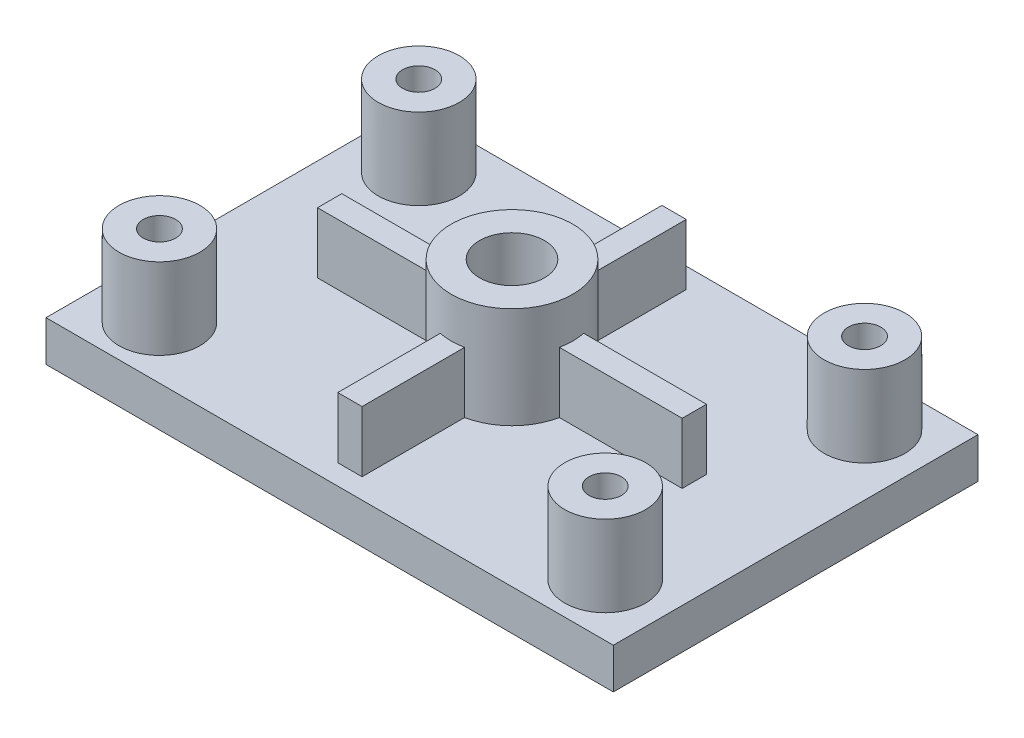
ISO-10303-21;
HEADER;
FILE_DESCRIPTION(('STEP AP214'),'2;1');
FILE_NAME('part.step','',(''),(''),'','','');
FILE_SCHEMA(('AUTOMOTIVE_DESIGN { 1 0 10303 214 1 1 1 1 }'));
ENDSEC;
DATA;
#1=APPLICATION_CONTEXT('core data for automotive mechanical design processes');
#2=APPLICATION_PROTOCOL_DEFINITION('international standard','automotive_design',2000,#1);
#3=PRODUCT_CONTEXT('',#1,'mechanical');
#4=PRODUCT('Part','Part','',(#3));
#5=PRODUCT_RELATED_PRODUCT_CATEGORY('part','',(#4));
#6=PRODUCT_DEFINITION_FORMATION('','',#4);
#7=PRODUCT_DEFINITION_CONTEXT('part definition',#1,'design');
#8=PRODUCT_DEFINITION('design','',#6,#7);
#9=PRODUCT_DEFINITION_SHAPE('','',#8);
#10=(LENGTH_UNIT() NAMED_UNIT(*) SI_UNIT(.MILLI.,.METRE.));
#11=(NAMED_UNIT(*) PLANE_ANGLE_UNIT() SI_UNIT($,.RADIAN.));
#12=(NAMED_UNIT(*) SI_UNIT($,.STERADIAN.) SOLID_ANGLE_UNIT());
#13=UNCERTAINTY_MEASURE_WITH_UNIT(LENGTH_MEASURE(1.E-05),#10,'distance_accuracy_value','');
#14=(GEOMETRIC_REPRESENTATION_CONTEXT(3) GLOBAL_UNCERTAINTY_ASSIGNED_CONTEXT((#13)) GLOBAL_UNIT_ASSIGNED_CONTEXT((#10,
#11,#12)) REPRESENTATION_CONTEXT('',''));
#15=CARTESIAN_POINT('',(0.,0.,0.));
#16=DIRECTION('',(0.,0.,1.));
#17=DIRECTION('',(1.,0.,0.));
#18=AXIS2_PLACEMENT_3D('',#15,#16,#17);
#19=CARTESIAN_POINT('',(45.,25.,3.));
#20=DIRECTION('',(0.,0.,-1.));
#21=DIRECTION('',(-1.,0.,0.));
#22=AXIS2_PLACEMENT_3D('',#19,#20,#21);
#23=PLANE('',#22);
#24=DIRECTION('',(0.,-1.,0.));
#25=VECTOR('',#24,1.);
#26=CARTESIAN_POINT('',(-14.6969384566991,35.,3.));
#27=LINE('',#26,#25);
#28=CARTESIAN_POINT('',(-14.6969384566991,25.,3.));
#29=VERTEX_POINT('',#28);
#30=CARTESIAN_POINT('',(-14.6969384566991,10.,3.));
#31=VERTEX_POINT('',#30);
#32=EDGE_CURVE('E285',#29,#31,#27,.T.);
#33=ORIENTED_EDGE('',*,*,#32,.F.);
#34=DIRECTION('',(1.,0.,0.));
#35=VECTOR('',#34,1.);
#36=CARTESIAN_POINT('',(45.,25.,3.));
#37=LINE('',#36,#35);
#38=CARTESIAN_POINT('',(-45.,25.,3.));
#39=VERTEX_POINT('',#38);
#40=EDGE_CURVE('E349',#39,#29,#37,.T.);
#41=ORIENTED_EDGE('',*,*,#40,.F.);
#42=DIRECTION('',(0.,-1.,0.));
#43=VECTOR('',#42,1.);
#44=CARTESIAN_POINT('',(-45.,25.,3.));
#45=LINE('',#44,#43);
#46=CARTESIAN_POINT('',(-45.,10.,3.));
#47=VERTEX_POINT('',#46);
#48=EDGE_CURVE('E386',#39,#47,#45,.T.);
#49=ORIENTED_EDGE('',*,*,#48,.T.);
#50=DIRECTION('',(1.,0.,0.));
#51=VECTOR('',#50,1.);
#52=CARTESIAN_POINT('',(45.,10.,3.));
#53=LINE('',#52,#51);
#54=EDGE_CURVE('E365',#47,#31,#53,.T.);
#55=ORIENTED_EDGE('',*,*,#54,.T.);
#56=EDGE_LOOP('',(#33,#41,#49,#55));
#57=FACE_BOUND('',#56,.T.);
#58=ADVANCED_FACE('F45',(#57),#23,.F.);
#59=DIRECTION('',(0.,-1.,0.));
#60=VECTOR('',#59,1.);
#61=CARTESIAN_POINT('',(14.6969384566991,35.,3.));
#62=LINE('',#61,#60);
#63=CARTESIAN_POINT('',(14.6969384566991,10.,3.));
#64=VERTEX_POINT('',#63);
#65=CARTESIAN_POINT('',(14.6969384566991,25.,3.));
#66=VERTEX_POINT('',#65);
#67=EDGE_CURVE('E71',#64,#66,#62,.F.);
#68=ORIENTED_EDGE('',*,*,#67,.F.);
#69=CARTESIAN_POINT('',(45.,10.,3.));
#70=VERTEX_POINT('',#69);
#71=EDGE_CURVE('E228',#64,#70,#53,.T.);
#72=ORIENTED_EDGE('',*,*,#71,.T.);
#73=DIRECTION('',(0.,-1.,0.));
#74=VECTOR('',#73,1.);
#75=CARTESIAN_POINT('',(45.,25.,3.));
#76=LINE('',#75,#74);
#77=CARTESIAN_POINT('',(45.,25.,3.));
#78=VERTEX_POINT('',#77);
#79=EDGE_CURVE('E382',#78,#70,#76,.T.);
#80=ORIENTED_EDGE('',*,*,#79,.F.);
#81=EDGE_CURVE('E347',#66,#78,#37,.T.);
#82=ORIENTED_EDGE('',*,*,#81,.F.);
#83=EDGE_LOOP('',(#68,#72,#80,#82));
#84=FACE_BOUND('',#83,.T.);
#85=ADVANCED_FACE('F594',(#84),#23,.F.);
#86=CARTESIAN_POINT('',(-45.,25.,-3.));
#87=DIRECTION('',(0.,0.,1.));
#88=DIRECTION('',(1.,0.,0.));
#89=AXIS2_PLACEMENT_3D('',#86,#87,#88);
#90=PLANE('',#89);
#91=DIRECTION('',(0.,-1.,0.));
#92=VECTOR('',#91,1.);
#93=CARTESIAN_POINT('',(-14.6969384566991,35.,-3.));
#94=LINE('',#93,#92);
#95=CARTESIAN_POINT('',(-14.6969384566991,10.,-3.));
#96=VERTEX_POINT('',#95);
#97=CARTESIAN_POINT('',(-14.6969384566991,25.,-3.));
#98=VERTEX_POINT('',#97);
#99=EDGE_CURVE('E255',#96,#98,#94,.F.);
#100=ORIENTED_EDGE('',*,*,#99,.F.);
#101=DIRECTION('',(-1.,0.,0.));
#102=VECTOR('',#101,1.);
#103=CARTESIAN_POINT('',(-45.,10.,-3.));
#104=LINE('',#103,#102);
#105=CARTESIAN_POINT('',(-45.,10.,-3.));
#106=VERTEX_POINT('',#105);
#107=EDGE_CURVE('E372',#96,#106,#104,.T.);
#108=ORIENTED_EDGE('',*,*,#107,.T.);
#109=DIRECTION('',(0.,-1.,0.));
#110=VECTOR('',#109,1.);
#111=CARTESIAN_POINT('',(-45.,25.,-3.));
#112=LINE('',#111,#110);
#113=CARTESIAN_POINT('',(-45.,25.,-3.));
#114=VERTEX_POINT('',#113);
#115=EDGE_CURVE('E361',#114,#106,#112,.T.);
#116=ORIENTED_EDGE('',*,*,#115,.F.);
#117=DIRECTION('',(-1.,0.,0.));
#118=VECTOR('',#117,1.);
#119=CARTESIAN_POINT('',(-45.,25.,-3.));
#120=LINE('',#119,#118);
#121=EDGE_CURVE('E356',#98,#114,#120,.T.);
#122=ORIENTED_EDGE('',*,*,#121,.F.);
#123=EDGE_LOOP('',(#100,#108,#116,#122));
#124=FACE_BOUND('',#123,.T.);
#125=ADVANCED_FACE('F599',(#124),#90,.F.);
#126=DIRECTION('',(0.,-1.,0.));
#127=VECTOR('',#126,1.);
#128=CARTESIAN_POINT('',(14.6969384566991,35.,-3.));
#129=LINE('',#128,#127);
#130=CARTESIAN_POINT('',(14.6969384566991,25.,-3.));
#131=VERTEX_POINT('',#130);
#132=CARTESIAN_POINT('',(14.6969384566991,10.,-3.));
#133=VERTEX_POINT('',#132);
#134=EDGE_CURVE('E270',#131,#133,#129,.T.);
#135=ORIENTED_EDGE('',*,*,#134,.F.);
#136=CARTESIAN_POINT('',(45.,25.,-3.));
#137=VERTEX_POINT('',#136);
#138=EDGE_CURVE('E357',#137,#131,#120,.T.);
#139=ORIENTED_EDGE('',*,*,#138,.F.);
#140=DIRECTION('',(0.,-1.,0.));
#141=VECTOR('',#140,1.);
#142=CARTESIAN_POINT('',(45.,25.,-3.));
#143=LINE('',#142,#141);
#144=CARTESIAN_POINT('',(45.,10.,-3.));
#145=VERTEX_POINT('',#144);
#146=EDGE_CURVE('E379',#137,#145,#143,.T.);
#147=ORIENTED_EDGE('',*,*,#146,.T.);
#148=EDGE_CURVE('E348',#145,#133,#104,.T.);
#149=ORIENTED_EDGE('',*,*,#148,.T.);
#150=EDGE_LOOP('',(#135,#139,#147,#149));
#151=FACE_BOUND('',#150,.T.);
#152=ADVANCED_FACE('F796',(#151),#90,.F.);
#153=CARTESIAN_POINT('',(0.,25.,0.));
#154=DIRECTION('',(0.,-1.,0.));
#155=DIRECTION('',(0.,0.,-1.));
#156=AXIS2_PLACEMENT_3D('',#153,#154,#155);
#157=PLANE('',#156);
#158=CARTESIAN_POINT('',(0.,25.,0.));
#159=DIRECTION('',(0.,-1.,0.));
#160=DIRECTION('',(0.,0.,-1.));
#161=AXIS2_PLACEMENT_3D('',#158,#159,#160);
#162=CIRCLE('',#161,15.);
#163=EDGE_CURVE('E244',#98,#29,#162,.F.);
#164=ORIENTED_EDGE('',*,*,#163,.F.);
#165=ORIENTED_EDGE('',*,*,#121,.T.);
#166=DIRECTION('',(0.,0.,1.));
#167=VECTOR('',#166,1.);
#168=CARTESIAN_POINT('',(-45.,25.,3.));
#169=LINE('',#168,#167);
#170=EDGE_CURVE('E343',#114,#39,#169,.T.);
#171=ORIENTED_EDGE('',*,*,#170,.T.);
#172=ORIENTED_EDGE('',*,*,#40,.T.);
#173=EDGE_LOOP('',(#164,#165,#171,#172));
#174=FACE_BOUND('',#173,.T.);
#175=ADVANCED_FACE('F629',(#174),#157,.F.);
#176=CARTESIAN_POINT('',(-3.,25.,14.6969384566991));
#177=VERTEX_POINT('',#176);
#178=CARTESIAN_POINT('',(3.,25.,14.6969384566991));
#179=VERTEX_POINT('',#178);
#180=EDGE_CURVE('E238',#177,#179,#162,.F.);
#181=ORIENTED_EDGE('',*,*,#180,.F.);
#182=DIRECTION('',(0.,0.,1.));
#183=VECTOR('',#182,1.);
#184=CARTESIAN_POINT('',(-3.,25.,40.));
#185=LINE('',#184,#183);
#186=CARTESIAN_POINT('',(-3.,25.,40.));
#187=VERTEX_POINT('',#186);
#188=EDGE_CURVE('E311',#177,#187,#185,.T.);
#189=ORIENTED_EDGE('',*,*,#188,.T.);
#190=DIRECTION('',(1.,0.,0.));
#191=VECTOR('',#190,1.);
#192=CARTESIAN_POINT('',(3.,25.,40.));
#193=LINE('',#192,#191);
#194=CARTESIAN_POINT('',(3.,25.,40.));
#195=VERTEX_POINT('',#194);
#196=EDGE_CURVE('E310',#187,#195,#193,.T.);
#197=ORIENTED_EDGE('',*,*,#196,.T.);
#198=DIRECTION('',(0.,0.,-1.));
#199=VECTOR('',#198,1.);
#200=CARTESIAN_POINT('',(3.,25.,-40.));
#201=LINE('',#200,#199);
#202=EDGE_CURVE('E314',#195,#179,#201,.T.);
#203=ORIENTED_EDGE('',*,*,#202,.T.);
#204=EDGE_LOOP('',(#181,#189,#197,#203));
#205=FACE_BOUND('',#204,.T.);
#206=ADVANCED_FACE('F815',(#205),#157,.F.);
#207=EDGE_CURVE('E256',#66,#131,#162,.F.);
#208=ORIENTED_EDGE('',*,*,#207,.F.);
#209=ORIENTED_EDGE('',*,*,#81,.T.);
#210=DIRECTION('',(0.,0.,-1.));
#211=VECTOR('',#210,1.);
#212=CARTESIAN_POINT('',(45.,25.,-3.));
#213=LINE('',#212,#211);
#214=EDGE_CURVE('E353',#78,#137,#213,.T.);
#215=ORIENTED_EDGE('',*,*,#214,.T.);
#216=ORIENTED_EDGE('',*,*,#138,.T.);
#217=EDGE_LOOP('',(#208,#209,#215,#216));
#218=FACE_BOUND('',#217,.T.);
#219=ADVANCED_FACE('F630',(#218),#157,.F.);
#220=CARTESIAN_POINT('',(3.,25.,-40.));
#221=DIRECTION('',(-1.,0.,0.));
#222=DIRECTION('',(0.,0.,1.));
#223=AXIS2_PLACEMENT_3D('',#220,#221,#222);
#224=PLANE('',#223);
#225=DIRECTION('',(0.,-1.,0.));
#226=VECTOR('',#225,1.);
#227=CARTESIAN_POINT('',(3.,35.,-14.6969384566991));
#228=LINE('',#227,#226);
#229=CARTESIAN_POINT('',(3.,10.,-14.6969384566991));
#230=VERTEX_POINT('',#229);
#231=CARTESIAN_POINT('',(3.,25.,-14.6969384566991));
#232=VERTEX_POINT('',#231);
#233=EDGE_CURVE('E259',#230,#232,#228,.F.);
#234=ORIENTED_EDGE('',*,*,#233,.F.);
#235=DIRECTION('',(0.,0.,-1.));
#236=VECTOR('',#235,1.);
#237=CARTESIAN_POINT('',(3.,10.,-40.));
#238=LINE('',#237,#236);
#239=CARTESIAN_POINT('',(3.,10.,-40.));
#240=VERTEX_POINT('',#239);
#241=EDGE_CURVE('E221',#230,#240,#238,.T.);
#242=ORIENTED_EDGE('',*,*,#241,.T.);
#243=DIRECTION('',(0.,-1.,0.));
#244=VECTOR('',#243,1.);
#245=CARTESIAN_POINT('',(3.,25.,-40.));
#246=LINE('',#245,#244);
#247=CARTESIAN_POINT('',(3.,25.,-40.));
#248=VERTEX_POINT('',#247);
#249=EDGE_CURVE('E333',#248,#240,#246,.T.);
#250=ORIENTED_EDGE('',*,*,#249,.F.);
#251=EDGE_CURVE('E313',#232,#248,#201,.T.);
#252=ORIENTED_EDGE('',*,*,#251,.F.);
#253=EDGE_LOOP('',(#234,#242,#250,#252));
#254=FACE_BOUND('',#253,.T.);
#255=ADVANCED_FACE('F835',(#254),#224,.F.);
#256=CARTESIAN_POINT('',(-3.,25.,40.));
#257=DIRECTION('',(1.,0.,0.));
#258=DIRECTION('',(0.,0.,-1.));
#259=AXIS2_PLACEMENT_3D('',#256,#257,#258);
#260=PLANE('',#259);
#261=DIRECTION('',(0.,-1.,0.));
#262=VECTOR('',#261,1.);
#263=CARTESIAN_POINT('',(-3.,35.,-14.6969384566991));
#264=LINE('',#263,#262);
#265=CARTESIAN_POINT('',(-3.,25.,-14.6969384566991));
#266=VERTEX_POINT('',#265);
#267=CARTESIAN_POINT('',(-3.,10.,-14.6969384566991));
#268=VERTEX_POINT('',#267);
#269=EDGE_CURVE('E249',#266,#268,#264,.T.);
#270=ORIENTED_EDGE('',*,*,#269,.F.);
#271=CARTESIAN_POINT('',(-3.,25.,-40.));
#272=VERTEX_POINT('',#271);
#273=EDGE_CURVE('E306',#272,#266,#185,.T.);
#274=ORIENTED_EDGE('',*,*,#273,.F.);
#275=DIRECTION('',(0.,-1.,0.));
#276=VECTOR('',#275,1.);
#277=CARTESIAN_POINT('',(-3.,25.,-40.));
#278=LINE('',#277,#276);
#279=CARTESIAN_POINT('',(-3.,10.,-40.));
#280=VERTEX_POINT('',#279);
#281=EDGE_CURVE('E320',#272,#280,#278,.T.);
#282=ORIENTED_EDGE('',*,*,#281,.T.);
#283=DIRECTION('',(0.,0.,1.));
#284=VECTOR('',#283,1.);
#285=CARTESIAN_POINT('',(-3.,10.,40.));
#286=LINE('',#285,#284);
#287=EDGE_CURVE('E321',#280,#268,#286,.T.);
#288=ORIENTED_EDGE('',*,*,#287,.T.);
#289=EDGE_LOOP('',(#270,#274,#282,#288));
#290=FACE_BOUND('',#289,.T.);
#291=ADVANCED_FACE('F846',(#290),#260,.F.);
#292=DIRECTION('',(0.,-1.,0.));
#293=VECTOR('',#292,1.);
#294=CARTESIAN_POINT('',(-3.,35.,14.6969384566991));
#295=LINE('',#294,#293);
#296=CARTESIAN_POINT('',(-3.,10.,14.6969384566991));
#297=VERTEX_POINT('',#296);
#298=EDGE_CURVE('E239',#297,#177,#295,.F.);
#299=ORIENTED_EDGE('',*,*,#298,.F.);
#300=CARTESIAN_POINT('',(-3.,10.,40.));
#301=VERTEX_POINT('',#300);
#302=EDGE_CURVE('E305',#297,#301,#286,.T.);
#303=ORIENTED_EDGE('',*,*,#302,.T.);
#304=DIRECTION('',(0.,-1.,0.));
#305=VECTOR('',#304,1.);
#306=CARTESIAN_POINT('',(-3.,25.,40.));
#307=LINE('',#306,#305);
#308=EDGE_CURVE('E338',#187,#301,#307,.T.);
#309=ORIENTED_EDGE('',*,*,#308,.F.);
#310=ORIENTED_EDGE('',*,*,#188,.F.);
#311=EDGE_LOOP('',(#299,#303,#309,#310));
#312=FACE_BOUND('',#311,.T.);
#313=ADVANCED_FACE('F857',(#312),#260,.F.);
#314=DIRECTION('',(0.,-1.,0.));
#315=VECTOR('',#314,1.);
#316=CARTESIAN_POINT('',(3.,35.,14.6969384566991));
#317=LINE('',#316,#315);
#318=CARTESIAN_POINT('',(3.,10.,14.6969384566991));
#319=VERTEX_POINT('',#318);
#320=EDGE_CURVE('E11',#179,#319,#317,.T.);
#321=ORIENTED_EDGE('',*,*,#320,.F.);
#322=ORIENTED_EDGE('',*,*,#202,.F.);
#323=DIRECTION('',(0.,-1.,0.));
#324=VECTOR('',#323,1.);
#325=CARTESIAN_POINT('',(3.,25.,40.));
#326=LINE('',#325,#324);
#327=CARTESIAN_POINT('',(3.,10.,40.));
#328=VERTEX_POINT('',#327);
#329=EDGE_CURVE('E217',#195,#328,#326,.T.);
#330=ORIENTED_EDGE('',*,*,#329,.T.);
#331=EDGE_CURVE('E211',#328,#319,#238,.T.);
#332=ORIENTED_EDGE('',*,*,#331,.T.);
#333=EDGE_LOOP('',(#321,#322,#330,#332));
#334=FACE_BOUND('',#333,.T.);
#335=ADVANCED_FACE('F213',(#334),#224,.F.);
#336=CARTESIAN_POINT('',(0.,10.,0.));
#337=DIRECTION('',(0.,-1.,0.));
#338=DIRECTION('',(0.,0.,-1.));
#339=AXIS2_PLACEMENT_3D('',#336,#337,#338);
#340=PLANE('',#339);
#341=CARTESIAN_POINT('',(0.,10.,0.));
#342=DIRECTION('',(0.,1.,0.));
#343=DIRECTION('',(0.,0.,1.));
#344=AXIS2_PLACEMENT_3D('',#341,#342,#343);
#345=CIRCLE('',#344,15.);
#346=EDGE_CURVE('E519',#268,#96,#345,.T.);
#347=ORIENTED_EDGE('',*,*,#346,.F.);
#348=ORIENTED_EDGE('',*,*,#287,.F.);
#349=DIRECTION('',(-1.,0.,0.));
#350=VECTOR('',#349,1.);
#351=CARTESIAN_POINT('',(-3.,10.,-40.));
#352=LINE('',#351,#350);
#353=EDGE_CURVE('E220',#240,#280,#352,.T.);
#354=ORIENTED_EDGE('',*,*,#353,.F.);
#355=ORIENTED_EDGE('',*,*,#241,.F.);
#356=EDGE_CURVE('E232',#133,#230,#345,.T.);
#357=ORIENTED_EDGE('',*,*,#356,.F.);
#358=ORIENTED_EDGE('',*,*,#148,.F.);
#359=DIRECTION('',(0.,0.,-1.));
#360=VECTOR('',#359,1.);
#361=CARTESIAN_POINT('',(45.,10.,-3.));
#362=LINE('',#361,#360);
#363=EDGE_CURVE('E368',#70,#145,#362,.T.);
#364=ORIENTED_EDGE('',*,*,#363,.F.);
#365=ORIENTED_EDGE('',*,*,#71,.F.);
#366=EDGE_CURVE('E224',#319,#64,#345,.T.);
#367=ORIENTED_EDGE('',*,*,#366,.F.);
#368=ORIENTED_EDGE('',*,*,#331,.F.);
#369=DIRECTION('',(1.,0.,0.));
#370=VECTOR('',#369,1.);
#371=CARTESIAN_POINT('',(3.,10.,40.));
#372=LINE('',#371,#370);
#373=EDGE_CURVE('E325',#301,#328,#372,.T.);
#374=ORIENTED_EDGE('',*,*,#373,.F.);
#375=ORIENTED_EDGE('',*,*,#302,.F.);
#376=EDGE_CURVE('E63',#31,#297,#345,.T.);
#377=ORIENTED_EDGE('',*,*,#376,.F.);
#378=ORIENTED_EDGE('',*,*,#54,.F.);
#379=DIRECTION('',(0.,0.,1.));
#380=VECTOR('',#379,1.);
#381=CARTESIAN_POINT('',(-45.,10.,3.));
#382=LINE('',#381,#380);
#383=EDGE_CURVE('E342',#106,#47,#382,.T.);
#384=ORIENTED_EDGE('',*,*,#383,.F.);
#385=ORIENTED_EDGE('',*,*,#107,.F.);
#386=EDGE_LOOP('',(#347,#348,#354,#355,#357,#358,#364,#365,#367,#368,#374,#375,#377,#378,#384,#385));
#387=FACE_BOUND('',#386,.T.);
#388=CARTESIAN_POINT('',(55.,10.,-32.));
#389=DIRECTION('',(0.,-1.,0.));
#390=DIRECTION('',(0.,0.,-1.));
#391=AXIS2_PLACEMENT_3D('',#388,#389,#390);
#392=CIRCLE('',#391,10.);
#393=CARTESIAN_POINT('',(55.,10.,-42.));
#394=VERTEX_POINT('',#393);
#395=EDGE_CURVE('E55',#394,#394,#392,.F.);
#396=ORIENTED_EDGE('',*,*,#395,.F.);
#397=EDGE_LOOP('',(#396));
#398=FACE_BOUND('',#397,.T.);
#399=CARTESIAN_POINT('',(-55.,10.,32.));
#400=DIRECTION('',(0.,-1.,0.));
#401=DIRECTION('',(0.,0.,-1.));
#402=AXIS2_PLACEMENT_3D('',#399,#400,#401);
#403=CIRCLE('',#402,10.);
#404=CARTESIAN_POINT('',(-55.,10.,22.));
#405=VERTEX_POINT('',#404);
#406=EDGE_CURVE('E481',#405,#405,#403,.F.);
#407=ORIENTED_EDGE('',*,*,#406,.F.);
#408=EDGE_LOOP('',(#407));
#409=FACE_BOUND('',#408,.T.);
#410=CARTESIAN_POINT('',(55.,10.,32.));
#411=DIRECTION('',(0.,-1.,0.));
#412=DIRECTION('',(0.,0.,-1.));
#413=AXIS2_PLACEMENT_3D('',#410,#411,#412);
#414=CIRCLE('',#413,10.);
#415=CARTESIAN_POINT('',(55.,10.,22.));
#416=VERTEX_POINT('',#415);
#417=EDGE_CURVE('E477',#416,#416,#414,.F.);
#418=ORIENTED_EDGE('',*,*,#417,.F.);
#419=EDGE_LOOP('',(#418));
#420=FACE_BOUND('',#419,.T.);
#421=CARTESIAN_POINT('',(-55.,10.,-32.));
#422=DIRECTION('',(0.,-1.,0.));
#423=DIRECTION('',(0.,0.,-1.));
#424=AXIS2_PLACEMENT_3D('',#421,#422,#423);
#425=CIRCLE('',#424,10.);
#426=CARTESIAN_POINT('',(-55.,10.,-42.));
#427=VERTEX_POINT('',#426);
#428=EDGE_CURVE('E473',#427,#427,#425,.F.);
#429=ORIENTED_EDGE('',*,*,#428,.F.);
#430=EDGE_LOOP('',(#429));
#431=FACE_BOUND('',#430,.T.);
#432=DIRECTION('',(0.,0.,1.));
#433=VECTOR('',#432,1.);
#434=CARTESIAN_POINT('',(-70.,10.,45.));
#435=LINE('',#434,#433);
#436=CARTESIAN_POINT('',(-70.,10.,-45.));
#437=VERTEX_POINT('',#436);
#438=CARTESIAN_POINT('',(-70.,10.,45.));
#439=VERTEX_POINT('',#438);
#440=EDGE_CURVE('E433',#437,#439,#435,.T.);
#441=ORIENTED_EDGE('',*,*,#440,.T.);
#442=DIRECTION('',(1.,0.,0.));
#443=VECTOR('',#442,1.);
#444=CARTESIAN_POINT('',(70.,10.,45.));
#445=LINE('',#444,#443);
#446=CARTESIAN_POINT('',(70.,10.,45.));
#447=VERTEX_POINT('',#446);
#448=EDGE_CURVE('E437',#439,#447,#445,.T.);
#449=ORIENTED_EDGE('',*,*,#448,.T.);
#450=DIRECTION('',(0.,0.,-1.));
#451=VECTOR('',#450,1.);
#452=CARTESIAN_POINT('',(70.,10.,-45.));
#453=LINE('',#452,#451);
#454=CARTESIAN_POINT('',(70.,10.,-45.));
#455=VERTEX_POINT('',#454);
#456=EDGE_CURVE('E441',#447,#455,#453,.T.);
#457=ORIENTED_EDGE('',*,*,#456,.T.);
#458=DIRECTION('',(-1.,0.,0.));
#459=VECTOR('',#458,1.);
#460=CARTESIAN_POINT('',(-70.,10.,-45.));
#461=LINE('',#460,#459);
#462=EDGE_CURVE('E444',#455,#437,#461,.T.);
#463=ORIENTED_EDGE('',*,*,#462,.T.);
#464=EDGE_LOOP('',(#441,#449,#457,#463));
#465=FACE_BOUND('',#464,.T.);
#466=ADVANCED_FACE('F225',(#387,#398,#409,#420,#431,#465),#340,.F.);
#467=CARTESIAN_POINT('',(0.,0.,0.));
#468=DIRECTION('',(0.,-1.,0.));
#469=DIRECTION('',(0.,0.,-1.));
#470=AXIS2_PLACEMENT_3D('',#467,#468,#469);
#471=PLANE('',#470);
#472=CARTESIAN_POINT('',(55.,0.,-32.));
#473=DIRECTION('',(0.,-1.,0.));
#474=DIRECTION('',(0.,0.,-1.));
#475=AXIS2_PLACEMENT_3D('',#472,#473,#474);
#476=CIRCLE('',#475,4.);
#477=CARTESIAN_POINT('',(55.,0.,-36.));
#478=VERTEX_POINT('',#477);
#479=EDGE_CURVE('E492',#478,#478,#476,.T.);
#480=ORIENTED_EDGE('',*,*,#479,.F.);
#481=EDGE_LOOP('',(#480));
#482=FACE_BOUND('',#481,.T.);
#483=CARTESIAN_POINT('',(-55.,0.,32.));
#484=DIRECTION('',(0.,-1.,0.));
#485=DIRECTION('',(0.,0.,-1.));
#486=AXIS2_PLACEMENT_3D('',#483,#484,#485);
#487=CIRCLE('',#486,4.);
#488=CARTESIAN_POINT('',(-55.,0.,28.));
#489=VERTEX_POINT('',#488);
#490=EDGE_CURVE('E497',#489,#489,#487,.T.);
#491=ORIENTED_EDGE('',*,*,#490,.F.);
#492=EDGE_LOOP('',(#491));
#493=FACE_BOUND('',#492,.T.);
#494=CARTESIAN_POINT('',(55.,0.,32.));
#495=DIRECTION('',(0.,-1.,0.));
#496=DIRECTION('',(0.,0.,-1.));
#497=AXIS2_PLACEMENT_3D('',#494,#495,#496);
#498=CIRCLE('',#497,4.);
#499=CARTESIAN_POINT('',(55.,0.,28.));
#500=VERTEX_POINT('',#499);
#501=EDGE_CURVE('E500',#500,#500,#498,.T.);
#502=ORIENTED_EDGE('',*,*,#501,.F.);
#503=EDGE_LOOP('',(#502));
#504=FACE_BOUND('',#503,.T.);
#505=CARTESIAN_POINT('',(-55.,0.,-32.));
#506=DIRECTION('',(0.,-1.,0.));
#507=DIRECTION('',(0.,0.,-1.));
#508=AXIS2_PLACEMENT_3D('',#505,#506,#507);
#509=CIRCLE('',#508,4.);
#510=CARTESIAN_POINT('',(-55.,0.,-36.));
#511=VERTEX_POINT('',#510);
#512=EDGE_CURVE('E513',#511,#511,#509,.T.);
#513=ORIENTED_EDGE('',*,*,#512,.F.);
#514=EDGE_LOOP('',(#513));
#515=FACE_BOUND('',#514,.T.);
#516=DIRECTION('',(0.,0.,1.));
#517=VECTOR('',#516,1.);
#518=CARTESIAN_POINT('',(-70.,0.,45.));
#519=LINE('',#518,#517);
#520=CARTESIAN_POINT('',(-70.,0.,-45.));
#521=VERTEX_POINT('',#520);
#522=CARTESIAN_POINT('',(-70.,0.,45.));
#523=VERTEX_POINT('',#522);
#524=EDGE_CURVE('E432',#521,#523,#519,.T.);
#525=ORIENTED_EDGE('',*,*,#524,.F.);
#526=DIRECTION('',(-1.,0.,0.));
#527=VECTOR('',#526,1.);
#528=CARTESIAN_POINT('',(-70.,0.,-45.));
#529=LINE('',#528,#527);
#530=CARTESIAN_POINT('',(70.,0.,-45.));
#531=VERTEX_POINT('',#530);
#532=EDGE_CURVE('E438',#531,#521,#529,.T.);
#533=ORIENTED_EDGE('',*,*,#532,.F.);
#534=DIRECTION('',(0.,0.,-1.));
#535=VECTOR('',#534,1.);
#536=CARTESIAN_POINT('',(70.,0.,-45.));
#537=LINE('',#536,#535);
#538=CARTESIAN_POINT('',(70.,0.,45.));
#539=VERTEX_POINT('',#538);
#540=EDGE_CURVE('E454',#539,#531,#537,.T.);
#541=ORIENTED_EDGE('',*,*,#540,.F.);
#542=DIRECTION('',(1.,0.,0.));
#543=VECTOR('',#542,1.);
#544=CARTESIAN_POINT('',(70.,0.,45.));
#545=LINE('',#544,#543);
#546=EDGE_CURVE('E451',#523,#539,#545,.T.);
#547=ORIENTED_EDGE('',*,*,#546,.F.);
#548=EDGE_LOOP('',(#525,#533,#541,#547));
#549=FACE_BOUND('',#548,.T.);
#550=DIRECTION('',(-1.,0.,0.));
#551=VECTOR('',#550,1.);
#552=CARTESIAN_POINT('',(-40.,0.,-25.));
#553=LINE('',#552,#551);
#554=CARTESIAN_POINT('',(40.,0.,-25.));
#555=VERTEX_POINT('',#554);
#556=CARTESIAN_POINT('',(-40.,0.,-25.));
#557=VERTEX_POINT('',#556);
#558=EDGE_CURVE('E396',#555,#557,#553,.T.);
#559=ORIENTED_EDGE('',*,*,#558,.T.);
#560=DIRECTION('',(0.,0.,1.));
#561=VECTOR('',#560,1.);
#562=CARTESIAN_POINT('',(-40.,0.,25.));
#563=LINE('',#562,#561);
#564=CARTESIAN_POINT('',(-40.,0.,25.));
#565=VERTEX_POINT('',#564);
#566=EDGE_CURVE('E390',#557,#565,#563,.T.);
#567=ORIENTED_EDGE('',*,*,#566,.T.);
#568=DIRECTION('',(1.,0.,0.));
#569=VECTOR('',#568,1.);
#570=CARTESIAN_POINT('',(40.,0.,25.));
#571=LINE('',#570,#569);
#572=CARTESIAN_POINT('',(40.,0.,25.));
#573=VERTEX_POINT('',#572);
#574=EDGE_CURVE('E409',#565,#573,#571,.T.);
#575=ORIENTED_EDGE('',*,*,#574,.T.);
#576=DIRECTION('',(0.,0.,-1.));
#577=VECTOR('',#576,1.);
#578=CARTESIAN_POINT('',(40.,0.,-25.));
#579=LINE('',#578,#577);
#580=EDGE_CURVE('E413',#573,#555,#579,.T.);
#581=ORIENTED_EDGE('',*,*,#580,.T.);
#582=EDGE_LOOP('',(#559,#567,#575,#581));
#583=FACE_BOUND('',#582,.T.);
#584=ADVANCED_FACE('F543',(#482,#493,#504,#515,#549,#583),#471,.T.);
#585=CARTESIAN_POINT('',(-70.,10.,45.));
#586=DIRECTION('',(1.,0.,0.));
#587=DIRECTION('',(0.,0.,-1.));
#588=AXIS2_PLACEMENT_3D('',#585,#586,#587);
#589=PLANE('',#588);
#590=ORIENTED_EDGE('',*,*,#524,.T.);
#591=DIRECTION('',(0.,-1.,0.));
#592=VECTOR('',#591,1.);
#593=CARTESIAN_POINT('',(-70.,10.,45.));
#594=LINE('',#593,#592);
#595=EDGE_CURVE('E469',#439,#523,#594,.T.);
#596=ORIENTED_EDGE('',*,*,#595,.F.);
#597=ORIENTED_EDGE('',*,*,#440,.F.);
#598=DIRECTION('',(0.,-1.,0.));
#599=VECTOR('',#598,1.);
#600=CARTESIAN_POINT('',(-70.,10.,-45.));
#601=LINE('',#600,#599);
#602=EDGE_CURVE('E447',#437,#521,#601,.T.);
#603=ORIENTED_EDGE('',*,*,#602,.T.);
#604=EDGE_LOOP('',(#590,#596,#597,#603));
#605=FACE_BOUND('',#604,.T.);
#606=ADVANCED_FACE('F47',(#605),#589,.F.);
#607=CARTESIAN_POINT('',(70.,10.,45.));
#608=DIRECTION('',(0.,0.,-1.));
#609=DIRECTION('',(-1.,0.,0.));
#610=AXIS2_PLACEMENT_3D('',#607,#608,#609);
#611=PLANE('',#610);
#612=ORIENTED_EDGE('',*,*,#546,.T.);
#613=DIRECTION('',(0.,-1.,0.));
#614=VECTOR('',#613,1.);
#615=CARTESIAN_POINT('',(70.,10.,45.));
#616=LINE('',#615,#614);
#617=EDGE_CURVE('E465',#447,#539,#616,.T.);
#618=ORIENTED_EDGE('',*,*,#617,.F.);
#619=ORIENTED_EDGE('',*,*,#448,.F.);
#620=ORIENTED_EDGE('',*,*,#595,.T.);
#621=EDGE_LOOP('',(#612,#618,#619,#620));
#622=FACE_BOUND('',#621,.T.);
#623=ADVANCED_FACE('F553',(#622),#611,.F.);
#624=CARTESIAN_POINT('',(70.,10.,-45.));
#625=DIRECTION('',(-1.,0.,0.));
#626=DIRECTION('',(0.,0.,1.));
#627=AXIS2_PLACEMENT_3D('',#624,#625,#626);
#628=PLANE('',#627);
#629=ORIENTED_EDGE('',*,*,#540,.T.);
#630=DIRECTION('',(0.,-1.,0.));
#631=VECTOR('',#630,1.);
#632=CARTESIAN_POINT('',(70.,10.,-45.));
#633=LINE('',#632,#631);
#634=EDGE_CURVE('E461',#455,#531,#633,.T.);
#635=ORIENTED_EDGE('',*,*,#634,.F.);
#636=ORIENTED_EDGE('',*,*,#456,.F.);
#637=ORIENTED_EDGE('',*,*,#617,.T.);
#638=EDGE_LOOP('',(#629,#635,#636,#637));
#639=FACE_BOUND('',#638,.T.);
#640=ADVANCED_FACE('F558',(#639),#628,.F.);
#641=CARTESIAN_POINT('',(-70.,10.,-45.));
#642=DIRECTION('',(0.,0.,1.));
#643=DIRECTION('',(1.,0.,0.));
#644=AXIS2_PLACEMENT_3D('',#641,#642,#643);
#645=PLANE('',#644);
#646=ORIENTED_EDGE('',*,*,#532,.T.);
#647=ORIENTED_EDGE('',*,*,#602,.F.);
#648=ORIENTED_EDGE('',*,*,#462,.F.);
#649=ORIENTED_EDGE('',*,*,#634,.T.);
#650=EDGE_LOOP('',(#646,#647,#648,#649));
#651=FACE_BOUND('',#650,.T.);
#652=ADVANCED_FACE('F561',(#651),#645,.F.);
#653=CARTESIAN_POINT('',(-40.,4.,25.));
#654=DIRECTION('',(1.,0.,0.));
#655=DIRECTION('',(0.,0.,-1.));
#656=AXIS2_PLACEMENT_3D('',#653,#654,#655);
#657=PLANE('',#656);
#658=ORIENTED_EDGE('',*,*,#566,.F.);
#659=DIRECTION('',(0.,-1.,0.));
#660=VECTOR('',#659,1.);
#661=CARTESIAN_POINT('',(-40.,4.,-25.));
#662=LINE('',#661,#660);
#663=CARTESIAN_POINT('',(-40.,4.,-25.));
#664=VERTEX_POINT('',#663);
#665=EDGE_CURVE('E405',#664,#557,#662,.T.);
#666=ORIENTED_EDGE('',*,*,#665,.F.);
#667=DIRECTION('',(0.,0.,1.));
#668=VECTOR('',#667,1.);
#669=CARTESIAN_POINT('',(-40.,4.,25.));
#670=LINE('',#669,#668);
#671=CARTESIAN_POINT('',(-40.,4.,25.));
#672=VERTEX_POINT('',#671);
#673=EDGE_CURVE('E391',#664,#672,#670,.T.);
#674=ORIENTED_EDGE('',*,*,#673,.T.);
#675=DIRECTION('',(0.,-1.,0.));
#676=VECTOR('',#675,1.);
#677=CARTESIAN_POINT('',(-40.,4.,25.));
#678=LINE('',#677,#676);
#679=EDGE_CURVE('E429',#672,#565,#678,.T.);
#680=ORIENTED_EDGE('',*,*,#679,.T.);
#681=EDGE_LOOP('',(#658,#666,#674,#680));
#682=FACE_BOUND('',#681,.T.);
#683=ADVANCED_FACE('F576',(#682),#657,.T.);
#684=CARTESIAN_POINT('',(40.,4.,25.));
#685=DIRECTION('',(0.,0.,-1.));
#686=DIRECTION('',(-1.,0.,0.));
#687=AXIS2_PLACEMENT_3D('',#684,#685,#686);
#688=PLANE('',#687);
#689=ORIENTED_EDGE('',*,*,#574,.F.);
#690=ORIENTED_EDGE('',*,*,#679,.F.);
#691=DIRECTION('',(1.,0.,0.));
#692=VECTOR('',#691,1.);
#693=CARTESIAN_POINT('',(40.,4.,25.));
#694=LINE('',#693,#692);
#695=CARTESIAN_POINT('',(40.,4.,25.));
#696=VERTEX_POINT('',#695);
#697=EDGE_CURVE('E395',#672,#696,#694,.T.);
#698=ORIENTED_EDGE('',*,*,#697,.T.);
#699=DIRECTION('',(0.,-1.,0.));
#700=VECTOR('',#699,1.);
#701=CARTESIAN_POINT('',(40.,4.,25.));
#702=LINE('',#701,#700);
#703=EDGE_CURVE('E426',#696,#573,#702,.T.);
#704=ORIENTED_EDGE('',*,*,#703,.T.);
#705=EDGE_LOOP('',(#689,#690,#698,#704));
#706=FACE_BOUND('',#705,.T.);
#707=ADVANCED_FACE('F583',(#706),#688,.T.);
#708=CARTESIAN_POINT('',(40.,4.,-25.));
#709=DIRECTION('',(-1.,0.,0.));
#710=DIRECTION('',(0.,0.,1.));
#711=AXIS2_PLACEMENT_3D('',#708,#709,#710);
#712=PLANE('',#711);
#713=ORIENTED_EDGE('',*,*,#580,.F.);
#714=ORIENTED_EDGE('',*,*,#703,.F.);
#715=DIRECTION('',(0.,0.,-1.));
#716=VECTOR('',#715,1.);
#717=CARTESIAN_POINT('',(40.,4.,-25.));
#718=LINE('',#717,#716);
#719=CARTESIAN_POINT('',(40.,4.,-25.));
#720=VERTEX_POINT('',#719);
#721=EDGE_CURVE('E399',#696,#720,#718,.T.);
#722=ORIENTED_EDGE('',*,*,#721,.T.);
#723=DIRECTION('',(0.,-1.,0.));
#724=VECTOR('',#723,1.);
#725=CARTESIAN_POINT('',(40.,4.,-25.));
#726=LINE('',#725,#724);
#727=EDGE_CURVE('E423',#720,#555,#726,.T.);
#728=ORIENTED_EDGE('',*,*,#727,.T.);
#729=EDGE_LOOP('',(#713,#714,#722,#728));
#730=FACE_BOUND('',#729,.T.);
#731=ADVANCED_FACE('F585',(#730),#712,.T.);
#732=CARTESIAN_POINT('',(-40.,4.,-25.));
#733=DIRECTION('',(0.,0.,1.));
#734=DIRECTION('',(1.,0.,0.));
#735=AXIS2_PLACEMENT_3D('',#732,#733,#734);
#736=PLANE('',#735);
#737=ORIENTED_EDGE('',*,*,#558,.F.);
#738=ORIENTED_EDGE('',*,*,#727,.F.);
#739=DIRECTION('',(-1.,0.,0.));
#740=VECTOR('',#739,1.);
#741=CARTESIAN_POINT('',(-40.,4.,-25.));
#742=LINE('',#741,#740);
#743=EDGE_CURVE('E402',#720,#664,#742,.T.);
#744=ORIENTED_EDGE('',*,*,#743,.T.);
#745=ORIENTED_EDGE('',*,*,#665,.T.);
#746=EDGE_LOOP('',(#737,#738,#744,#745));
#747=FACE_BOUND('',#746,.T.);
#748=ADVANCED_FACE('F571',(#747),#736,.T.);
#749=CARTESIAN_POINT('',(0.,4.,0.));
#750=DIRECTION('',(0.,-1.,0.));
#751=DIRECTION('',(0.,0.,-1.));
#752=AXIS2_PLACEMENT_3D('',#749,#750,#751);
#753=PLANE('',#752);
#754=ORIENTED_EDGE('',*,*,#673,.F.);
#755=ORIENTED_EDGE('',*,*,#743,.F.);
#756=ORIENTED_EDGE('',*,*,#721,.F.);
#757=ORIENTED_EDGE('',*,*,#697,.F.);
#758=EDGE_LOOP('',(#754,#755,#756,#757));
#759=FACE_BOUND('',#758,.T.);
#760=ADVANCED_FACE('F579',(#759),#753,.T.);
#761=CARTESIAN_POINT('',(-45.,25.,3.));
#762=DIRECTION('',(1.,0.,0.));
#763=DIRECTION('',(0.,0.,-1.));
#764=AXIS2_PLACEMENT_3D('',#761,#762,#763);
#765=PLANE('',#764);
#766=ORIENTED_EDGE('',*,*,#383,.T.);
#767=ORIENTED_EDGE('',*,*,#48,.F.);
#768=ORIENTED_EDGE('',*,*,#170,.F.);
#769=ORIENTED_EDGE('',*,*,#115,.T.);
#770=EDGE_LOOP('',(#766,#767,#768,#769));
#771=FACE_BOUND('',#770,.T.);
#772=ADVANCED_FACE('F604',(#771),#765,.F.);
#773=CARTESIAN_POINT('',(45.,25.,-3.));
#774=DIRECTION('',(-1.,0.,0.));
#775=DIRECTION('',(0.,0.,1.));
#776=AXIS2_PLACEMENT_3D('',#773,#774,#775);
#777=PLANE('',#776);
#778=ORIENTED_EDGE('',*,*,#363,.T.);
#779=ORIENTED_EDGE('',*,*,#146,.F.);
#780=ORIENTED_EDGE('',*,*,#214,.F.);
#781=ORIENTED_EDGE('',*,*,#79,.T.);
#782=EDGE_LOOP('',(#778,#779,#780,#781));
#783=FACE_BOUND('',#782,.T.);
#784=ADVANCED_FACE('F602',(#783),#777,.F.);
#785=EDGE_CURVE('E245',#232,#266,#162,.F.);
#786=ORIENTED_EDGE('',*,*,#785,.F.);
#787=ORIENTED_EDGE('',*,*,#251,.T.);
#788=DIRECTION('',(-1.,0.,0.));
#789=VECTOR('',#788,1.);
#790=CARTESIAN_POINT('',(-3.,25.,-40.));
#791=LINE('',#790,#789);
#792=EDGE_CURVE('E317',#248,#272,#791,.T.);
#793=ORIENTED_EDGE('',*,*,#792,.T.);
#794=ORIENTED_EDGE('',*,*,#273,.T.);
#795=EDGE_LOOP('',(#786,#787,#793,#794));
#796=FACE_BOUND('',#795,.T.);
#797=ADVANCED_FACE('F619',(#796),#157,.F.);
#798=CARTESIAN_POINT('',(-3.,25.,-40.));
#799=DIRECTION('',(0.,0.,1.));
#800=DIRECTION('',(1.,0.,0.));
#801=AXIS2_PLACEMENT_3D('',#798,#799,#800);
#802=PLANE('',#801);
#803=ORIENTED_EDGE('',*,*,#353,.T.);
#804=ORIENTED_EDGE('',*,*,#281,.F.);
#805=ORIENTED_EDGE('',*,*,#792,.F.);
#806=ORIENTED_EDGE('',*,*,#249,.T.);
#807=EDGE_LOOP('',(#803,#804,#805,#806));
#808=FACE_BOUND('',#807,.T.);
#809=ADVANCED_FACE('F626',(#808),#802,.F.);
#810=CARTESIAN_POINT('',(3.,25.,40.));
#811=DIRECTION('',(0.,0.,-1.));
#812=DIRECTION('',(-1.,0.,0.));
#813=AXIS2_PLACEMENT_3D('',#810,#811,#812);
#814=PLANE('',#813);
#815=ORIENTED_EDGE('',*,*,#373,.T.);
#816=ORIENTED_EDGE('',*,*,#329,.F.);
#817=ORIENTED_EDGE('',*,*,#196,.F.);
#818=ORIENTED_EDGE('',*,*,#308,.T.);
#819=EDGE_LOOP('',(#815,#816,#817,#818));
#820=FACE_BOUND('',#819,.T.);
#821=ADVANCED_FACE('F537',(#820),#814,.F.);
#822=CARTESIAN_POINT('',(-55.,30.,-32.));
#823=DIRECTION('',(0.,-1.,0.));
#824=DIRECTION('',(0.,0.,-1.));
#825=AXIS2_PLACEMENT_3D('',#822,#823,#824);
#826=CYLINDRICAL_SURFACE('',#825,10.);
#827=CARTESIAN_POINT('',(-55.,30.,-32.));
#828=DIRECTION('',(0.,1.,0.));
#829=DIRECTION('',(0.,0.,1.));
#830=AXIS2_PLACEMENT_3D('',#827,#828,#829);
#831=CIRCLE('',#830,10.);
#832=CARTESIAN_POINT('',(-55.,30.,-22.));
#833=VERTEX_POINT('',#832);
#834=EDGE_CURVE('E298',#833,#833,#831,.T.);
#835=ORIENTED_EDGE('',*,*,#834,.F.);
#836=EDGE_LOOP('',(#835));
#837=FACE_BOUND('',#836,.T.);
#838=ORIENTED_EDGE('',*,*,#428,.T.);
#839=EDGE_LOOP('',(#838));
#840=FACE_BOUND('',#839,.T.);
#841=ADVANCED_FACE('F531',(#837,#840),#826,.T.);
#842=CARTESIAN_POINT('',(-55.,30.,-32.));
#843=DIRECTION('',(0.,1.,0.));
#844=DIRECTION('',(0.,0.,1.));
#845=AXIS2_PLACEMENT_3D('',#842,#843,#844);
#846=PLANE('',#845);
#847=CARTESIAN_POINT('',(-55.,30.,-32.));
#848=DIRECTION('',(0.,1.,0.));
#849=DIRECTION('',(0.,0.,1.));
#850=AXIS2_PLACEMENT_3D('',#847,#848,#849);
#851=CIRCLE('',#850,4.);
#852=CARTESIAN_POINT('',(-55.,30.,-28.));
#853=VERTEX_POINT('',#852);
#854=EDGE_CURVE('E49',#853,#853,#851,.T.);
#855=ORIENTED_EDGE('',*,*,#854,.F.);
#856=EDGE_LOOP('',(#855));
#857=FACE_BOUND('',#856,.T.);
#858=ORIENTED_EDGE('',*,*,#834,.T.);
#859=EDGE_LOOP('',(#858));
#860=FACE_BOUND('',#859,.T.);
#861=ADVANCED_FACE('F527',(#857,#860),#846,.T.);
#862=CARTESIAN_POINT('',(55.,30.,32.));
#863=DIRECTION('',(0.,-1.,0.));
#864=DIRECTION('',(0.,0.,-1.));
#865=AXIS2_PLACEMENT_3D('',#862,#863,#864);
#866=CYLINDRICAL_SURFACE('',#865,10.);
#867=CARTESIAN_POINT('',(55.,30.,32.));
#868=DIRECTION('',(0.,1.,0.));
#869=DIRECTION('',(0.,0.,1.));
#870=AXIS2_PLACEMENT_3D('',#867,#868,#869);
#871=CIRCLE('',#870,10.);
#872=CARTESIAN_POINT('',(55.,30.,42.));
#873=VERTEX_POINT('',#872);
#874=EDGE_CURVE('E289',#873,#873,#871,.T.);
#875=ORIENTED_EDGE('',*,*,#874,.F.);
#876=EDGE_LOOP('',(#875));
#877=FACE_BOUND('',#876,.T.);
#878=ORIENTED_EDGE('',*,*,#417,.T.);
#879=EDGE_LOOP('',(#878));
#880=FACE_BOUND('',#879,.T.);
#881=ADVANCED_FACE('F530',(#877,#880),#866,.T.);
#882=CARTESIAN_POINT('',(55.,30.,32.));
#883=DIRECTION('',(0.,1.,0.));
#884=DIRECTION('',(0.,0.,1.));
#885=AXIS2_PLACEMENT_3D('',#882,#883,#884);
#886=PLANE('',#885);
#887=CARTESIAN_POINT('',(55.,30.,32.));
#888=DIRECTION('',(0.,1.,0.));
#889=DIRECTION('',(0.,0.,1.));
#890=AXIS2_PLACEMENT_3D('',#887,#888,#889);
#891=CIRCLE('',#890,4.);
#892=CARTESIAN_POINT('',(55.,30.,36.));
#893=VERTEX_POINT('',#892);
#894=EDGE_CURVE('E498',#893,#893,#891,.T.);
#895=ORIENTED_EDGE('',*,*,#894,.F.);
#896=EDGE_LOOP('',(#895));
#897=FACE_BOUND('',#896,.T.);
#898=ORIENTED_EDGE('',*,*,#874,.T.);
#899=EDGE_LOOP('',(#898));
#900=FACE_BOUND('',#899,.T.);
#901=ADVANCED_FACE('F656',(#897,#900),#886,.T.);
#902=CARTESIAN_POINT('',(-55.,30.,32.));
#903=DIRECTION('',(0.,-1.,0.));
#904=DIRECTION('',(0.,0.,-1.));
#905=AXIS2_PLACEMENT_3D('',#902,#903,#904);
#906=CYLINDRICAL_SURFACE('',#905,10.);
#907=CARTESIAN_POINT('',(-55.,30.,32.));
#908=DIRECTION('',(0.,1.,0.));
#909=DIRECTION('',(0.,0.,1.));
#910=AXIS2_PLACEMENT_3D('',#907,#908,#909);
#911=CIRCLE('',#910,10.);
#912=CARTESIAN_POINT('',(-55.,30.,42.));
#913=VERTEX_POINT('',#912);
#914=EDGE_CURVE('E293',#913,#913,#911,.T.);
#915=ORIENTED_EDGE('',*,*,#914,.F.);
#916=EDGE_LOOP('',(#915));
#917=FACE_BOUND('',#916,.T.);
#918=ORIENTED_EDGE('',*,*,#406,.T.);
#919=EDGE_LOOP('',(#918));
#920=FACE_BOUND('',#919,.T.);
#921=ADVANCED_FACE('F663',(#917,#920),#906,.T.);
#922=CARTESIAN_POINT('',(-55.,30.,32.));
#923=DIRECTION('',(0.,1.,0.));
#924=DIRECTION('',(0.,0.,1.));
#925=AXIS2_PLACEMENT_3D('',#922,#923,#924);
#926=PLANE('',#925);
#927=CARTESIAN_POINT('',(-55.,30.,32.));
#928=DIRECTION('',(0.,1.,0.));
#929=DIRECTION('',(0.,0.,1.));
#930=AXIS2_PLACEMENT_3D('',#927,#928,#929);
#931=CIRCLE('',#930,4.);
#932=CARTESIAN_POINT('',(-55.,30.,36.));
#933=VERTEX_POINT('',#932);
#934=EDGE_CURVE('E494',#933,#933,#931,.T.);
#935=ORIENTED_EDGE('',*,*,#934,.F.);
#936=EDGE_LOOP('',(#935));
#937=FACE_BOUND('',#936,.T.);
#938=ORIENTED_EDGE('',*,*,#914,.T.);
#939=EDGE_LOOP('',(#938));
#940=FACE_BOUND('',#939,.T.);
#941=ADVANCED_FACE('F670',(#937,#940),#926,.T.);
#942=CARTESIAN_POINT('',(55.,30.,-32.));
#943=DIRECTION('',(0.,-1.,0.));
#944=DIRECTION('',(0.,0.,-1.));
#945=AXIS2_PLACEMENT_3D('',#942,#943,#944);
#946=CYLINDRICAL_SURFACE('',#945,10.);
#947=CARTESIAN_POINT('',(55.,30.,-32.));
#948=DIRECTION('',(0.,1.,0.));
#949=DIRECTION('',(0.,0.,1.));
#950=AXIS2_PLACEMENT_3D('',#947,#948,#949);
#951=CIRCLE('',#950,10.);
#952=CARTESIAN_POINT('',(55.,30.,-22.));
#953=VERTEX_POINT('',#952);
#954=EDGE_CURVE('E294',#953,#953,#951,.T.);
#955=ORIENTED_EDGE('',*,*,#954,.F.);
#956=EDGE_LOOP('',(#955));
#957=FACE_BOUND('',#956,.T.);
#958=ORIENTED_EDGE('',*,*,#395,.T.);
#959=EDGE_LOOP('',(#958));
#960=FACE_BOUND('',#959,.T.);
#961=ADVANCED_FACE('F677',(#957,#960),#946,.T.);
#962=CARTESIAN_POINT('',(55.,30.,-32.));
#963=DIRECTION('',(0.,1.,0.));
#964=DIRECTION('',(0.,0.,1.));
#965=AXIS2_PLACEMENT_3D('',#962,#963,#964);
#966=PLANE('',#965);
#967=CARTESIAN_POINT('',(55.,30.,-32.));
#968=DIRECTION('',(0.,1.,0.));
#969=DIRECTION('',(0.,0.,1.));
#970=AXIS2_PLACEMENT_3D('',#967,#968,#969);
#971=CIRCLE('',#970,4.);
#972=CARTESIAN_POINT('',(55.,30.,-28.));
#973=VERTEX_POINT('',#972);
#974=EDGE_CURVE('E488',#973,#973,#971,.T.);
#975=ORIENTED_EDGE('',*,*,#974,.F.);
#976=EDGE_LOOP('',(#975));
#977=FACE_BOUND('',#976,.T.);
#978=ORIENTED_EDGE('',*,*,#954,.T.);
#979=EDGE_LOOP('',(#978));
#980=FACE_BOUND('',#979,.T.);
#981=ADVANCED_FACE('F684',(#977,#980),#966,.T.);
#982=CARTESIAN_POINT('',(0.,35.,0.));
#983=DIRECTION('',(0.,-1.,0.));
#984=DIRECTION('',(0.,0.,-1.));
#985=AXIS2_PLACEMENT_3D('',#982,#983,#984);
#986=CYLINDRICAL_SURFACE('',#985,15.);
#987=CARTESIAN_POINT('',(0.,35.,0.));
#988=DIRECTION('',(0.,1.,0.));
#989=DIRECTION('',(0.,0.,1.));
#990=AXIS2_PLACEMENT_3D('',#987,#988,#989);
#991=CIRCLE('',#990,15.);
#992=CARTESIAN_POINT('',(0.,35.,15.));
#993=VERTEX_POINT('',#992);
#994=EDGE_CURVE('E231',#993,#993,#991,.T.);
#995=ORIENTED_EDGE('',*,*,#994,.F.);
#996=EDGE_LOOP('',(#995));
#997=FACE_BOUND('',#996,.T.);
#998=ORIENTED_EDGE('',*,*,#163,.T.);
#999=ORIENTED_EDGE('',*,*,#32,.T.);
#1000=ORIENTED_EDGE('',*,*,#376,.T.);
#1001=ORIENTED_EDGE('',*,*,#298,.T.);
#1002=ORIENTED_EDGE('',*,*,#180,.T.);
#1003=ORIENTED_EDGE('',*,*,#320,.T.);
#1004=ORIENTED_EDGE('',*,*,#366,.T.);
#1005=ORIENTED_EDGE('',*,*,#67,.T.);
#1006=ORIENTED_EDGE('',*,*,#207,.T.);
#1007=ORIENTED_EDGE('',*,*,#134,.T.);
#1008=ORIENTED_EDGE('',*,*,#356,.T.);
#1009=ORIENTED_EDGE('',*,*,#233,.T.);
#1010=ORIENTED_EDGE('',*,*,#785,.T.);
#1011=ORIENTED_EDGE('',*,*,#269,.T.);
#1012=ORIENTED_EDGE('',*,*,#346,.T.);
#1013=ORIENTED_EDGE('',*,*,#99,.T.);
#1014=EDGE_LOOP('',(#998,#999,#1000,#1001,#1002,#1003,#1004,#1005,#1006,#1007,#1008,#1009,#1010,
#1011,#1012,#1013));
#1015=FACE_BOUND('',#1014,.T.);
#1016=ADVANCED_FACE('F236',(#997,#1015),#986,.T.);
#1017=CARTESIAN_POINT('',(0.,35.,0.));
#1018=DIRECTION('',(0.,1.,0.));
#1019=DIRECTION('',(0.,0.,1.));
#1020=AXIS2_PLACEMENT_3D('',#1017,#1018,#1019);
#1021=PLANE('',#1020);
#1022=CARTESIAN_POINT('',(0.,35.,0.));
#1023=DIRECTION('',(0.,1.,0.));
#1024=DIRECTION('',(0.,0.,1.));
#1025=AXIS2_PLACEMENT_3D('',#1022,#1023,#1024);
#1026=CIRCLE('',#1025,8.);
#1027=CARTESIAN_POINT('',(0.,35.,8.));
#1028=VERTEX_POINT('',#1027);
#1029=EDGE_CURVE('E1068',#1028,#1028,#1026,.T.);
#1030=ORIENTED_EDGE('',*,*,#1029,.F.);
#1031=EDGE_LOOP('',(#1030));
#1032=FACE_BOUND('',#1031,.T.);
#1033=ORIENTED_EDGE('',*,*,#994,.T.);
#1034=EDGE_LOOP('',(#1033));
#1035=FACE_BOUND('',#1034,.T.);
#1036=ADVANCED_FACE('F696',(#1032,#1035),#1021,.T.);
#1037=CARTESIAN_POINT('',(55.,-111.,-32.));
#1038=DIRECTION('',(0.,1.,0.));
#1039=DIRECTION('',(0.,0.,1.));
#1040=AXIS2_PLACEMENT_3D('',#1037,#1038,#1039);
#1041=CYLINDRICAL_SURFACE('',#1040,4.);
#1042=ORIENTED_EDGE('',*,*,#479,.T.);
#1043=EDGE_LOOP('',(#1042));
#1044=FACE_BOUND('',#1043,.T.);
#1045=ORIENTED_EDGE('',*,*,#974,.T.);
#1046=EDGE_LOOP('',(#1045));
#1047=FACE_BOUND('',#1046,.T.);
#1048=ADVANCED_FACE('F703',(#1044,#1047),#1041,.F.);
#1049=CARTESIAN_POINT('',(-55.,-111.,32.));
#1050=DIRECTION('',(0.,1.,0.));
#1051=DIRECTION('',(0.,0.,1.));
#1052=AXIS2_PLACEMENT_3D('',#1049,#1050,#1051);
#1053=CYLINDRICAL_SURFACE('',#1052,4.);
#1054=ORIENTED_EDGE('',*,*,#490,.T.);
#1055=EDGE_LOOP('',(#1054));
#1056=FACE_BOUND('',#1055,.T.);
#1057=ORIENTED_EDGE('',*,*,#934,.T.);
#1058=EDGE_LOOP('',(#1057));
#1059=FACE_BOUND('',#1058,.T.);
#1060=ADVANCED_FACE('F711',(#1056,#1059),#1053,.F.);
#1061=CARTESIAN_POINT('',(55.,-111.,32.));
#1062=DIRECTION('',(0.,1.,0.));
#1063=DIRECTION('',(0.,0.,1.));
#1064=AXIS2_PLACEMENT_3D('',#1061,#1062,#1063);
#1065=CYLINDRICAL_SURFACE('',#1064,4.);
#1066=ORIENTED_EDGE('',*,*,#501,.T.);
#1067=EDGE_LOOP('',(#1066));
#1068=FACE_BOUND('',#1067,.T.);
#1069=ORIENTED_EDGE('',*,*,#894,.T.);
#1070=EDGE_LOOP('',(#1069));
#1071=FACE_BOUND('',#1070,.T.);
#1072=ADVANCED_FACE('F718',(#1068,#1071),#1065,.F.);
#1073=CARTESIAN_POINT('',(-55.,-111.,-32.));
#1074=DIRECTION('',(0.,1.,0.));
#1075=DIRECTION('',(0.,0.,1.));
#1076=AXIS2_PLACEMENT_3D('',#1073,#1074,#1075);
#1077=CYLINDRICAL_SURFACE('',#1076,4.);
#1078=ORIENTED_EDGE('',*,*,#512,.T.);
#1079=EDGE_LOOP('',(#1078));
#1080=FACE_BOUND('',#1079,.T.);
#1081=ORIENTED_EDGE('',*,*,#854,.T.);
#1082=EDGE_LOOP('',(#1081));
#1083=FACE_BOUND('',#1082,.T.);
#1084=ADVANCED_FACE('F525',(#1080,#1083),#1077,.F.);
#1085=CARTESIAN_POINT('',(0.,15.,0.));
#1086=DIRECTION('',(0.,1.,0.));
#1087=DIRECTION('',(0.,0.,1.));
#1088=AXIS2_PLACEMENT_3D('',#1085,#1086,#1087);
#1089=CYLINDRICAL_SURFACE('',#1088,8.);
#1090=CARTESIAN_POINT('',(0.,15.,0.));
#1091=DIRECTION('',(0.,1.,0.));
#1092=DIRECTION('',(0.,0.,1.));
#1093=AXIS2_PLACEMENT_3D('',#1090,#1091,#1092);
#1094=CIRCLE('',#1093,8.);
#1095=CARTESIAN_POINT('',(0.,15.,8.));
#1096=VERTEX_POINT('',#1095);
#1097=EDGE_CURVE('E493',#1096,#1096,#1094,.T.);
#1098=ORIENTED_EDGE('',*,*,#1097,.F.);
#1099=EDGE_LOOP('',(#1098));
#1100=FACE_BOUND('',#1099,.T.);
#1101=ORIENTED_EDGE('',*,*,#1029,.T.);
#1102=EDGE_LOOP('',(#1101));
#1103=FACE_BOUND('',#1102,.T.);
#1104=ADVANCED_FACE('F729',(#1100,#1103),#1089,.F.);
#1105=CARTESIAN_POINT('',(0.,15.,0.));
#1106=DIRECTION('',(0.,1.,0.));
#1107=DIRECTION('',(0.,0.,1.));
#1108=AXIS2_PLACEMENT_3D('',#1105,#1106,#1107);
#1109=PLANE('',#1108);
#1110=ORIENTED_EDGE('',*,*,#1097,.T.);
#1111=EDGE_LOOP('',(#1110));
#1112=FACE_BOUND('',#1111,.T.);
#1113=ADVANCED_FACE('F734',(#1112),#1109,.T.);
#1114=CLOSED_SHELL('',(#58,#85,#125,#152,#175,#206,#219,#255,#291,#313,#335,#466,#584,#606,#623,
#640,#652,#683,#707,#731,#748,#760,#772,#784,#797,#809,#821,#841,#861,#881,#901,#921,#941,#961,
#981,#1016,#1036,#1048,#1060,#1072,#1084,#1104,#1113));
#1115=MANIFOLD_SOLID_BREP('B2',#1114);
#1116=ADVANCED_BREP_SHAPE_REPRESENTATION('',(#18,#1115),#14);
#1117=SHAPE_DEFINITION_REPRESENTATION(#9,#1116);
ENDSEC;
END-ISO-10303-21;
